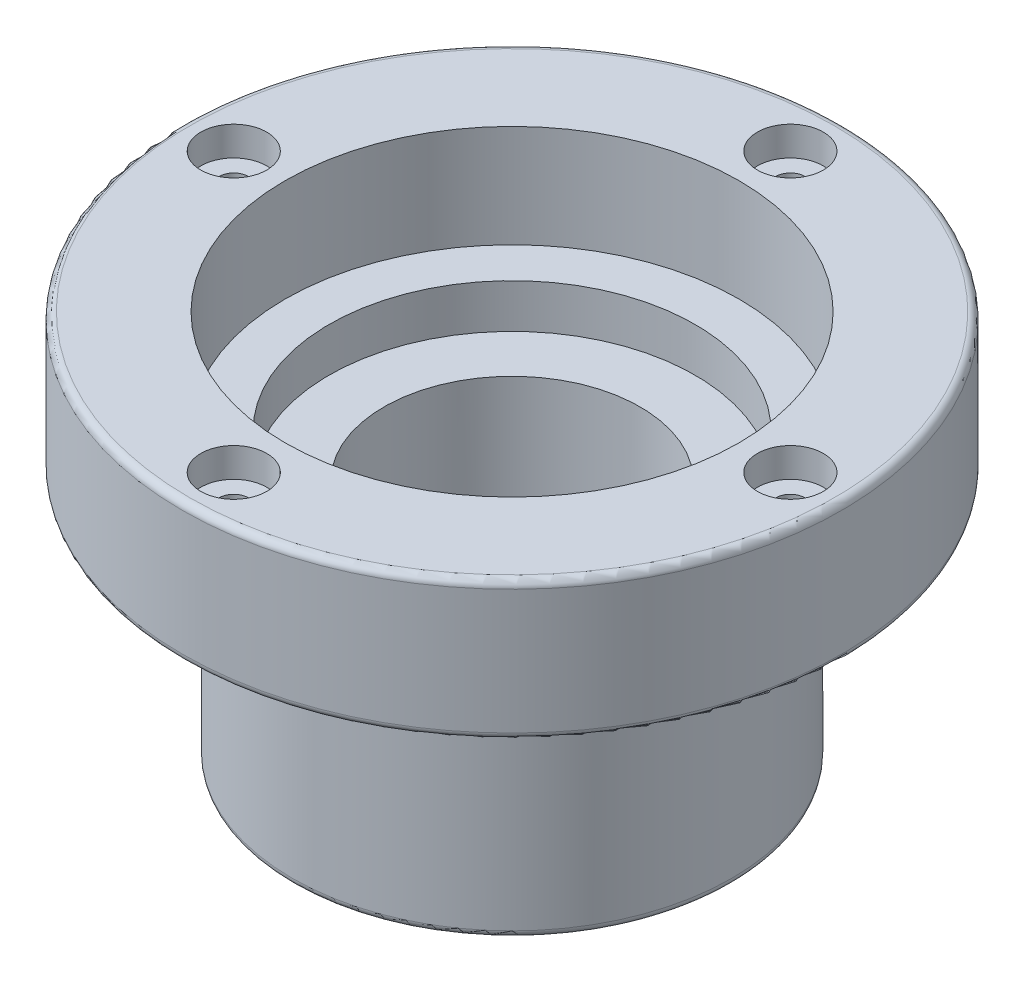
ISO-10303-21;
HEADER;
FILE_DESCRIPTION(('STEP AP214'),'2;1');
FILE_NAME('part.step','',(''),(''),'','','');
FILE_SCHEMA(('AUTOMOTIVE_DESIGN { 1 0 10303 214 1 1 1 1 }'));
ENDSEC;
DATA;
#1=APPLICATION_CONTEXT('core data for automotive mechanical design processes');
#2=APPLICATION_PROTOCOL_DEFINITION('international standard','automotive_design',2000,#1);
#3=PRODUCT_CONTEXT('',#1,'mechanical');
#4=PRODUCT('Part','Part','',(#3));
#5=PRODUCT_RELATED_PRODUCT_CATEGORY('part','',(#4));
#6=PRODUCT_DEFINITION_FORMATION('','',#4);
#7=PRODUCT_DEFINITION_CONTEXT('part definition',#1,'design');
#8=PRODUCT_DEFINITION('design','',#6,#7);
#9=PRODUCT_DEFINITION_SHAPE('','',#8);
#10=(LENGTH_UNIT() NAMED_UNIT(*) SI_UNIT(.MILLI.,.METRE.));
#11=(NAMED_UNIT(*) PLANE_ANGLE_UNIT() SI_UNIT($,.RADIAN.));
#12=(NAMED_UNIT(*) SI_UNIT($,.STERADIAN.) SOLID_ANGLE_UNIT());
#13=UNCERTAINTY_MEASURE_WITH_UNIT(LENGTH_MEASURE(1.E-05),#10,'distance_accuracy_value','');
#14=(GEOMETRIC_REPRESENTATION_CONTEXT(3) GLOBAL_UNCERTAINTY_ASSIGNED_CONTEXT((#13)) GLOBAL_UNIT_ASSIGNED_CONTEXT((#10,
#11,#12)) REPRESENTATION_CONTEXT('',''));
#15=CARTESIAN_POINT('',(0.,0.,0.));
#16=DIRECTION('',(0.,0.,1.));
#17=DIRECTION('',(1.,0.,0.));
#18=AXIS2_PLACEMENT_3D('',#15,#16,#17);
#19=CARTESIAN_POINT('',(0.,-20.,-38.));
#20=DIRECTION('',(0.,1.,0.));
#21=DIRECTION('',(0.,0.,1.));
#22=AXIS2_PLACEMENT_3D('',#19,#20,#21);
#23=CYLINDRICAL_SURFACE('',#22,2.);
#24=CARTESIAN_POINT('',(0.,-19.,-38.));
#25=DIRECTION('',(0.,1.,0.));
#26=DIRECTION('',(0.,0.,1.));
#27=AXIS2_PLACEMENT_3D('',#24,#25,#26);
#28=CIRCLE('',#27,2.);
#29=CARTESIAN_POINT('',(0.,-19.,-36.));
#30=VERTEX_POINT('',#29);
#31=EDGE_CURVE('E108',#30,#30,#28,.T.);
#32=ORIENTED_EDGE('',*,*,#31,.F.);
#33=EDGE_LOOP('',(#32));
#34=FACE_BOUND('',#33,.T.);
#35=CARTESIAN_POINT('',(0.,-4.,-38.));
#36=DIRECTION('',(0.,1.,0.));
#37=DIRECTION('',(0.,0.,1.));
#38=AXIS2_PLACEMENT_3D('',#35,#36,#37);
#39=CIRCLE('',#38,2.);
#40=CARTESIAN_POINT('',(0.,-4.,-36.));
#41=VERTEX_POINT('',#40);
#42=EDGE_CURVE('E39',#41,#41,#39,.F.);
#43=ORIENTED_EDGE('',*,*,#42,.F.);
#44=EDGE_LOOP('',(#43));
#45=FACE_BOUND('',#44,.T.);
#46=ADVANCED_FACE('F35',(#34,#45),#23,.F.);
#47=CARTESIAN_POINT('',(0.,-20.,38.));
#48=DIRECTION('',(0.,1.,0.));
#49=DIRECTION('',(0.,0.,1.));
#50=AXIS2_PLACEMENT_3D('',#47,#48,#49);
#51=CYLINDRICAL_SURFACE('',#50,2.);
#52=CARTESIAN_POINT('',(0.,-19.,38.));
#53=DIRECTION('',(0.,1.,0.));
#54=DIRECTION('',(0.,0.,1.));
#55=AXIS2_PLACEMENT_3D('',#52,#53,#54);
#56=CIRCLE('',#55,2.);
#57=CARTESIAN_POINT('',(0.,-19.,40.));
#58=VERTEX_POINT('',#57);
#59=EDGE_CURVE('E102',#58,#58,#56,.T.);
#60=ORIENTED_EDGE('',*,*,#59,.F.);
#61=EDGE_LOOP('',(#60));
#62=FACE_BOUND('',#61,.T.);
#63=CARTESIAN_POINT('',(0.,-4.,38.));
#64=DIRECTION('',(0.,1.,0.));
#65=DIRECTION('',(0.,0.,1.));
#66=AXIS2_PLACEMENT_3D('',#63,#64,#65);
#67=CIRCLE('',#66,2.);
#68=CARTESIAN_POINT('',(0.,-4.,40.));
#69=VERTEX_POINT('',#68);
#70=EDGE_CURVE('E59',#69,#69,#67,.F.);
#71=ORIENTED_EDGE('',*,*,#70,.F.);
#72=EDGE_LOOP('',(#71));
#73=FACE_BOUND('',#72,.T.);
#74=ADVANCED_FACE('F168',(#62,#73),#51,.F.);
#75=CARTESIAN_POINT('',(38.,-20.,1.32676290876039E-13));
#76=DIRECTION('',(0.,1.,0.));
#77=DIRECTION('',(0.,0.,1.));
#78=AXIS2_PLACEMENT_3D('',#75,#76,#77);
#79=CYLINDRICAL_SURFACE('',#78,2.);
#80=CARTESIAN_POINT('',(38.,-19.,1.32676290876039E-13));
#81=DIRECTION('',(0.,1.,0.));
#82=DIRECTION('',(0.,0.,1.));
#83=AXIS2_PLACEMENT_3D('',#80,#81,#82);
#84=CIRCLE('',#83,2.);
#85=CARTESIAN_POINT('',(38.,-19.,2.00000000000014));
#86=VERTEX_POINT('',#85);
#87=EDGE_CURVE('E105',#86,#86,#84,.T.);
#88=ORIENTED_EDGE('',*,*,#87,.F.);
#89=EDGE_LOOP('',(#88));
#90=FACE_BOUND('',#89,.T.);
#91=CARTESIAN_POINT('',(38.,-4.,1.32676290876039E-13));
#92=DIRECTION('',(0.,1.,0.));
#93=DIRECTION('',(0.,0.,1.));
#94=AXIS2_PLACEMENT_3D('',#91,#92,#93);
#95=CIRCLE('',#94,2.);
#96=CARTESIAN_POINT('',(38.,-4.,2.00000000000014));
#97=VERTEX_POINT('',#96);
#98=EDGE_CURVE('E57',#97,#97,#95,.F.);
#99=ORIENTED_EDGE('',*,*,#98,.F.);
#100=EDGE_LOOP('',(#99));
#101=FACE_BOUND('',#100,.T.);
#102=ADVANCED_FACE('F174',(#90,#101),#79,.F.);
#103=CARTESIAN_POINT('',(-38.,-20.,-3.98028872628117E-13));
#104=DIRECTION('',(0.,1.,0.));
#105=DIRECTION('',(0.,0.,1.));
#106=AXIS2_PLACEMENT_3D('',#103,#104,#105);
#107=CYLINDRICAL_SURFACE('',#106,2.);
#108=CARTESIAN_POINT('',(-38.,-19.,-3.98028872628117E-13));
#109=DIRECTION('',(0.,1.,0.));
#110=DIRECTION('',(0.,0.,1.));
#111=AXIS2_PLACEMENT_3D('',#108,#109,#110);
#112=CIRCLE('',#111,2.);
#113=CARTESIAN_POINT('',(-38.,-19.,1.9999999999996));
#114=VERTEX_POINT('',#113);
#115=EDGE_CURVE('E97',#114,#114,#112,.T.);
#116=ORIENTED_EDGE('',*,*,#115,.F.);
#117=EDGE_LOOP('',(#116));
#118=FACE_BOUND('',#117,.T.);
#119=CARTESIAN_POINT('',(-38.,-4.,-3.98028872628117E-13));
#120=DIRECTION('',(0.,1.,0.));
#121=DIRECTION('',(0.,0.,1.));
#122=AXIS2_PLACEMENT_3D('',#119,#120,#121);
#123=CIRCLE('',#122,2.);
#124=CARTESIAN_POINT('',(-38.,-4.,1.9999999999996));
#125=VERTEX_POINT('',#124);
#126=EDGE_CURVE('E52',#125,#125,#123,.F.);
#127=ORIENTED_EDGE('',*,*,#126,.F.);
#128=EDGE_LOOP('',(#127));
#129=FACE_BOUND('',#128,.T.);
#130=ADVANCED_FACE('F181',(#118,#129),#107,.F.);
#131=CARTESIAN_POINT('',(0.,-19.,0.));
#132=DIRECTION('',(0.,1.,0.));
#133=DIRECTION('',(0.,0.,1.));
#134=AXIS2_PLACEMENT_3D('',#131,#132,#133);
#135=CYLINDRICAL_SURFACE('',#134,45.);
#136=CARTESIAN_POINT('',(0.,-18.,0.));
#137=DIRECTION('',(0.,1.,0.));
#138=DIRECTION('',(0.,0.,1.));
#139=AXIS2_PLACEMENT_3D('',#136,#137,#138);
#140=CIRCLE('',#139,45.);
#141=CARTESIAN_POINT('',(0.,-18.,45.));
#142=VERTEX_POINT('',#141);
#143=EDGE_CURVE('E43',#142,#142,#140,.T.);
#144=ORIENTED_EDGE('',*,*,#143,.T.);
#145=EDGE_LOOP('',(#144));
#146=FACE_BOUND('',#145,.T.);
#147=CARTESIAN_POINT('',(0.,-1.,0.));
#148=DIRECTION('',(0.,1.,0.));
#149=DIRECTION('',(0.,0.,1.));
#150=AXIS2_PLACEMENT_3D('',#147,#148,#149);
#151=CIRCLE('',#150,45.);
#152=CARTESIAN_POINT('',(0.,-1.,45.));
#153=VERTEX_POINT('',#152);
#154=EDGE_CURVE('E48',#153,#153,#151,.F.);
#155=ORIENTED_EDGE('',*,*,#154,.T.);
#156=EDGE_LOOP('',(#155));
#157=FACE_BOUND('',#156,.T.);
#158=ADVANCED_FACE('F152',(#146,#157),#135,.T.);
#159=CARTESIAN_POINT('',(0.,-19.,0.));
#160=DIRECTION('',(0.,1.,0.));
#161=DIRECTION('',(0.,0.,1.));
#162=AXIS2_PLACEMENT_3D('',#159,#160,#161);
#163=PLANE('',#162);
#164=CARTESIAN_POINT('',(0.,-19.,0.));
#165=DIRECTION('',(0.,1.,0.));
#166=DIRECTION('',(0.,0.,1.));
#167=AXIS2_PLACEMENT_3D('',#164,#165,#166);
#168=CIRCLE('',#167,31.);
#169=CARTESIAN_POINT('',(0.,-19.,31.));
#170=VERTEX_POINT('',#169);
#171=EDGE_CURVE('E147',#170,#170,#168,.T.);
#172=ORIENTED_EDGE('',*,*,#171,.T.);
#173=EDGE_LOOP('',(#172));
#174=FACE_BOUND('',#173,.T.);
#175=CARTESIAN_POINT('',(0.,-19.,0.));
#176=DIRECTION('',(0.,1.,0.));
#177=DIRECTION('',(0.,0.,1.));
#178=AXIS2_PLACEMENT_3D('',#175,#176,#177);
#179=CIRCLE('',#178,44.);
#180=CARTESIAN_POINT('',(0.,-19.,44.));
#181=VERTEX_POINT('',#180);
#182=EDGE_CURVE('E144',#181,#181,#179,.F.);
#183=ORIENTED_EDGE('',*,*,#182,.T.);
#184=EDGE_LOOP('',(#183));
#185=FACE_BOUND('',#184,.T.);
#186=ORIENTED_EDGE('',*,*,#87,.T.);
#187=EDGE_LOOP('',(#186));
#188=FACE_BOUND('',#187,.T.);
#189=ORIENTED_EDGE('',*,*,#59,.T.);
#190=EDGE_LOOP('',(#189));
#191=FACE_BOUND('',#190,.T.);
#192=ORIENTED_EDGE('',*,*,#115,.T.);
#193=EDGE_LOOP('',(#192));
#194=FACE_BOUND('',#193,.T.);
#195=ORIENTED_EDGE('',*,*,#31,.T.);
#196=EDGE_LOOP('',(#195));
#197=FACE_BOUND('',#196,.T.);
#198=ADVANCED_FACE('F220',(#174,#185,#188,#191,#194,#197),#163,.F.);
#199=CARTESIAN_POINT('',(0.,0.,0.));
#200=DIRECTION('',(0.,1.,0.));
#201=DIRECTION('',(0.,0.,1.));
#202=AXIS2_PLACEMENT_3D('',#199,#200,#201);
#203=PLANE('',#202);
#204=CARTESIAN_POINT('',(-2.65352581752078E-13,0.,38.));
#205=DIRECTION('',(0.,1.,0.));
#206=DIRECTION('',(1.,0.,0.));
#207=AXIS2_PLACEMENT_3D('',#204,#205,#206);
#208=CIRCLE('',#207,4.5);
#209=CARTESIAN_POINT('',(4.49999999999974,0.,38.));
#210=VERTEX_POINT('',#209);
#211=EDGE_CURVE('E329',#210,#210,#208,.T.);
#212=ORIENTED_EDGE('',*,*,#211,.F.);
#213=EDGE_LOOP('',(#212));
#214=FACE_BOUND('',#213,.T.);
#215=CARTESIAN_POINT('',(38.,0.,3.98028872628117E-13));
#216=DIRECTION('',(0.,1.,0.));
#217=DIRECTION('',(0.,0.,-1.));
#218=AXIS2_PLACEMENT_3D('',#215,#216,#217);
#219=CIRCLE('',#218,4.5);
#220=CARTESIAN_POINT('',(38.,0.,-4.49999999999961));
#221=VERTEX_POINT('',#220);
#222=EDGE_CURVE('E334',#221,#221,#219,.T.);
#223=ORIENTED_EDGE('',*,*,#222,.F.);
#224=EDGE_LOOP('',(#223));
#225=FACE_BOUND('',#224,.T.);
#226=CARTESIAN_POINT('',(0.,0.,-38.));
#227=DIRECTION('',(0.,1.,0.));
#228=DIRECTION('',(-1.,0.,0.));
#229=AXIS2_PLACEMENT_3D('',#226,#227,#228);
#230=CIRCLE('',#229,4.5);
#231=CARTESIAN_POINT('',(-4.5,0.,-38.));
#232=VERTEX_POINT('',#231);
#233=EDGE_CURVE('E340',#232,#232,#230,.T.);
#234=ORIENTED_EDGE('',*,*,#233,.F.);
#235=EDGE_LOOP('',(#234));
#236=FACE_BOUND('',#235,.T.);
#237=CARTESIAN_POINT('',(-38.,0.,-3.98028872628117E-13));
#238=DIRECTION('',(0.,1.,0.));
#239=DIRECTION('',(0.,0.,1.));
#240=AXIS2_PLACEMENT_3D('',#237,#238,#239);
#241=CIRCLE('',#240,4.5);
#242=CARTESIAN_POINT('',(-38.,0.,4.49999999999961));
#243=VERTEX_POINT('',#242);
#244=EDGE_CURVE('E65',#243,#243,#241,.T.);
#245=ORIENTED_EDGE('',*,*,#244,.F.);
#246=EDGE_LOOP('',(#245));
#247=FACE_BOUND('',#246,.T.);
#248=CARTESIAN_POINT('',(0.,0.,0.));
#249=DIRECTION('',(0.,1.,0.));
#250=DIRECTION('',(0.,0.,1.));
#251=AXIS2_PLACEMENT_3D('',#248,#249,#250);
#252=CIRCLE('',#251,44.);
#253=CARTESIAN_POINT('',(0.,0.,44.));
#254=VERTEX_POINT('',#253);
#255=EDGE_CURVE('E10',#254,#254,#252,.T.);
#256=ORIENTED_EDGE('',*,*,#255,.T.);
#257=EDGE_LOOP('',(#256));
#258=FACE_BOUND('',#257,.T.);
#259=CARTESIAN_POINT('',(0.,0.,0.));
#260=DIRECTION('',(0.,1.,0.));
#261=DIRECTION('',(0.,0.,1.));
#262=AXIS2_PLACEMENT_3D('',#259,#260,#261);
#263=CIRCLE('',#262,31.);
#264=CARTESIAN_POINT('',(0.,0.,31.));
#265=VERTEX_POINT('',#264);
#266=EDGE_CURVE('E118',#265,#265,#263,.T.);
#267=ORIENTED_EDGE('',*,*,#266,.F.);
#268=EDGE_LOOP('',(#267));
#269=FACE_BOUND('',#268,.T.);
#270=ADVANCED_FACE('F218',(#214,#225,#236,#247,#258,#269),#203,.T.);
#271=CARTESIAN_POINT('',(0.,-53.,0.));
#272=DIRECTION('',(0.,1.,0.));
#273=DIRECTION('',(0.,0.,1.));
#274=AXIS2_PLACEMENT_3D('',#271,#272,#273);
#275=CYLINDRICAL_SURFACE('',#274,30.);
#276=CARTESIAN_POINT('',(0.,-52.,0.));
#277=DIRECTION('',(0.,-1.,0.));
#278=DIRECTION('',(0.,0.,-1.));
#279=AXIS2_PLACEMENT_3D('',#276,#277,#278);
#280=CIRCLE('',#279,30.);
#281=CARTESIAN_POINT('',(0.,-52.,-30.));
#282=VERTEX_POINT('',#281);
#283=EDGE_CURVE('E141',#282,#282,#280,.F.);
#284=ORIENTED_EDGE('',*,*,#283,.T.);
#285=EDGE_LOOP('',(#284));
#286=FACE_BOUND('',#285,.T.);
#287=CARTESIAN_POINT('',(0.,-20.,0.));
#288=DIRECTION('',(0.,1.,0.));
#289=DIRECTION('',(0.,0.,1.));
#290=AXIS2_PLACEMENT_3D('',#287,#288,#289);
#291=CIRCLE('',#290,30.);
#292=CARTESIAN_POINT('',(0.,-20.,30.));
#293=VERTEX_POINT('',#292);
#294=EDGE_CURVE('E138',#293,#293,#291,.F.);
#295=ORIENTED_EDGE('',*,*,#294,.T.);
#296=EDGE_LOOP('',(#295));
#297=FACE_BOUND('',#296,.T.);
#298=ADVANCED_FACE('F214',(#286,#297),#275,.T.);
#299=CARTESIAN_POINT('',(0.,-53.,0.));
#300=DIRECTION('',(0.,-1.,0.));
#301=DIRECTION('',(0.,0.,-1.));
#302=AXIS2_PLACEMENT_3D('',#299,#300,#301);
#303=PLANE('',#302);
#304=CARTESIAN_POINT('',(0.,-53.,0.));
#305=DIRECTION('',(0.,-1.,0.));
#306=DIRECTION('',(0.,0.,-1.));
#307=AXIS2_PLACEMENT_3D('',#304,#305,#306);
#308=CIRCLE('',#307,29.);
#309=CARTESIAN_POINT('',(0.,-53.,-29.));
#310=VERTEX_POINT('',#309);
#311=EDGE_CURVE('E131',#310,#310,#308,.T.);
#312=ORIENTED_EDGE('',*,*,#311,.T.);
#313=EDGE_LOOP('',(#312));
#314=FACE_BOUND('',#313,.T.);
#315=CARTESIAN_POINT('',(-27.,-53.,0.));
#316=DIRECTION('',(0.,-1.,0.));
#317=DIRECTION('',(1.,0.,0.));
#318=AXIS2_PLACEMENT_3D('',#315,#316,#317);
#319=CIRCLE('',#318,1.5);
#320=CARTESIAN_POINT('',(-25.5,-53.,0.));
#321=VERTEX_POINT('',#320);
#322=EDGE_CURVE('E80',#321,#321,#319,.T.);
#323=ORIENTED_EDGE('',*,*,#322,.F.);
#324=EDGE_LOOP('',(#323));
#325=FACE_BOUND('',#324,.T.);
#326=CARTESIAN_POINT('',(0.,-53.,-27.));
#327=DIRECTION('',(0.,-1.,0.));
#328=DIRECTION('',(0.,0.,1.));
#329=AXIS2_PLACEMENT_3D('',#326,#327,#328);
#330=CIRCLE('',#329,1.5);
#331=CARTESIAN_POINT('',(0.,-53.,-25.5));
#332=VERTEX_POINT('',#331);
#333=EDGE_CURVE('E86',#332,#332,#330,.T.);
#334=ORIENTED_EDGE('',*,*,#333,.F.);
#335=EDGE_LOOP('',(#334));
#336=FACE_BOUND('',#335,.T.);
#337=CARTESIAN_POINT('',(27.,-53.,2.82809988446294E-13));
#338=DIRECTION('',(0.,-1.,0.));
#339=DIRECTION('',(-1.,0.,0.));
#340=AXIS2_PLACEMENT_3D('',#337,#338,#339);
#341=CIRCLE('',#340,1.5);
#342=CARTESIAN_POINT('',(25.5,-53.,2.670983224215E-13));
#343=VERTEX_POINT('',#342);
#344=EDGE_CURVE('E55',#343,#343,#341,.T.);
#345=ORIENTED_EDGE('',*,*,#344,.F.);
#346=EDGE_LOOP('',(#345));
#347=FACE_BOUND('',#346,.T.);
#348=CARTESIAN_POINT('',(0.,-53.,27.));
#349=DIRECTION('',(0.,-1.,0.));
#350=DIRECTION('',(0.,0.,-1.));
#351=AXIS2_PLACEMENT_3D('',#348,#349,#350);
#352=CIRCLE('',#351,1.5);
#353=CARTESIAN_POINT('',(0.,-53.,25.5));
#354=VERTEX_POINT('',#353);
#355=EDGE_CURVE('E79',#354,#354,#352,.T.);
#356=ORIENTED_EDGE('',*,*,#355,.F.);
#357=EDGE_LOOP('',(#356));
#358=FACE_BOUND('',#357,.T.);
#359=CARTESIAN_POINT('',(0.,-53.,0.));
#360=DIRECTION('',(0.,-1.,0.));
#361=DIRECTION('',(0.,0.,-1.));
#362=AXIS2_PLACEMENT_3D('',#359,#360,#361);
#363=CIRCLE('',#362,23.5);
#364=CARTESIAN_POINT('',(0.,-53.,-23.5));
#365=VERTEX_POINT('',#364);
#366=EDGE_CURVE('E125',#365,#365,#363,.T.);
#367=ORIENTED_EDGE('',*,*,#366,.F.);
#368=EDGE_LOOP('',(#367));
#369=FACE_BOUND('',#368,.T.);
#370=ADVANCED_FACE('F210',(#314,#325,#336,#347,#358,#369),#303,.T.);
#371=CARTESIAN_POINT('',(0.,-39.,0.));
#372=DIRECTION('',(0.,-1.,0.));
#373=DIRECTION('',(0.,0.,-1.));
#374=AXIS2_PLACEMENT_3D('',#371,#372,#373);
#375=CYLINDRICAL_SURFACE('',#374,23.5);
#376=CARTESIAN_POINT('',(0.,-39.,0.));
#377=DIRECTION('',(0.,-1.,0.));
#378=DIRECTION('',(0.,0.,-1.));
#379=AXIS2_PLACEMENT_3D('',#376,#377,#378);
#380=CIRCLE('',#379,23.5);
#381=CARTESIAN_POINT('',(0.,-39.,-23.5));
#382=VERTEX_POINT('',#381);
#383=EDGE_CURVE('E128',#382,#382,#380,.T.);
#384=ORIENTED_EDGE('',*,*,#383,.F.);
#385=EDGE_LOOP('',(#384));
#386=FACE_BOUND('',#385,.T.);
#387=ORIENTED_EDGE('',*,*,#366,.T.);
#388=EDGE_LOOP('',(#387));
#389=FACE_BOUND('',#388,.T.);
#390=ADVANCED_FACE('F206',(#386,#389),#375,.F.);
#391=CARTESIAN_POINT('',(0.,-39.,0.));
#392=DIRECTION('',(0.,-1.,0.));
#393=DIRECTION('',(0.,0.,-1.));
#394=AXIS2_PLACEMENT_3D('',#391,#392,#393);
#395=PLANE('',#394);
#396=CARTESIAN_POINT('',(0.,-39.,0.));
#397=DIRECTION('',(0.,-1.,0.));
#398=DIRECTION('',(0.,0.,-1.));
#399=AXIS2_PLACEMENT_3D('',#396,#397,#398);
#400=CIRCLE('',#399,17.5);
#401=CARTESIAN_POINT('',(0.,-39.,-17.5));
#402=VERTEX_POINT('',#401);
#403=EDGE_CURVE('E114',#402,#402,#400,.T.);
#404=ORIENTED_EDGE('',*,*,#403,.F.);
#405=EDGE_LOOP('',(#404));
#406=FACE_BOUND('',#405,.T.);
#407=ORIENTED_EDGE('',*,*,#383,.T.);
#408=EDGE_LOOP('',(#407));
#409=FACE_BOUND('',#408,.T.);
#410=ADVANCED_FACE('F202',(#406,#409),#395,.T.);
#411=CARTESIAN_POINT('',(0.,-14.,0.));
#412=DIRECTION('',(0.,1.,0.));
#413=DIRECTION('',(0.,0.,1.));
#414=AXIS2_PLACEMENT_3D('',#411,#412,#413);
#415=CYLINDRICAL_SURFACE('',#414,31.);
#416=CARTESIAN_POINT('',(0.,-14.,0.));
#417=DIRECTION('',(0.,1.,0.));
#418=DIRECTION('',(0.,0.,1.));
#419=AXIS2_PLACEMENT_3D('',#416,#417,#418);
#420=CIRCLE('',#419,31.);
#421=CARTESIAN_POINT('',(0.,-14.,31.));
#422=VERTEX_POINT('',#421);
#423=EDGE_CURVE('E122',#422,#422,#420,.T.);
#424=ORIENTED_EDGE('',*,*,#423,.F.);
#425=EDGE_LOOP('',(#424));
#426=FACE_BOUND('',#425,.T.);
#427=ORIENTED_EDGE('',*,*,#266,.T.);
#428=EDGE_LOOP('',(#427));
#429=FACE_BOUND('',#428,.T.);
#430=ADVANCED_FACE('F198',(#426,#429),#415,.F.);
#431=CARTESIAN_POINT('',(0.,-14.,0.));
#432=DIRECTION('',(0.,1.,0.));
#433=DIRECTION('',(0.,0.,1.));
#434=AXIS2_PLACEMENT_3D('',#431,#432,#433);
#435=PLANE('',#434);
#436=CARTESIAN_POINT('',(0.,-14.,0.));
#437=DIRECTION('',(0.,1.,0.));
#438=DIRECTION('',(0.,0.,1.));
#439=AXIS2_PLACEMENT_3D('',#436,#437,#438);
#440=CIRCLE('',#439,25.);
#441=CARTESIAN_POINT('',(0.,-14.,25.));
#442=VERTEX_POINT('',#441);
#443=EDGE_CURVE('E119',#442,#442,#440,.T.);
#444=ORIENTED_EDGE('',*,*,#443,.F.);
#445=EDGE_LOOP('',(#444));
#446=FACE_BOUND('',#445,.T.);
#447=ORIENTED_EDGE('',*,*,#423,.T.);
#448=EDGE_LOOP('',(#447));
#449=FACE_BOUND('',#448,.T.);
#450=ADVANCED_FACE('F194',(#446,#449),#435,.T.);
#451=CARTESIAN_POINT('',(0.,-20.,0.));
#452=DIRECTION('',(0.,1.,0.));
#453=DIRECTION('',(0.,0.,1.));
#454=AXIS2_PLACEMENT_3D('',#451,#452,#453);
#455=CYLINDRICAL_SURFACE('',#454,25.);
#456=CARTESIAN_POINT('',(0.,-20.,0.));
#457=DIRECTION('',(0.,1.,0.));
#458=DIRECTION('',(0.,0.,1.));
#459=AXIS2_PLACEMENT_3D('',#456,#457,#458);
#460=CIRCLE('',#459,25.);
#461=CARTESIAN_POINT('',(0.,-20.,25.));
#462=VERTEX_POINT('',#461);
#463=EDGE_CURVE('E115',#462,#462,#460,.T.);
#464=ORIENTED_EDGE('',*,*,#463,.F.);
#465=EDGE_LOOP('',(#464));
#466=FACE_BOUND('',#465,.T.);
#467=ORIENTED_EDGE('',*,*,#443,.T.);
#468=EDGE_LOOP('',(#467));
#469=FACE_BOUND('',#468,.T.);
#470=ADVANCED_FACE('F190',(#466,#469),#455,.F.);
#471=CARTESIAN_POINT('',(0.,-20.,0.));
#472=DIRECTION('',(0.,1.,0.));
#473=DIRECTION('',(0.,0.,1.));
#474=AXIS2_PLACEMENT_3D('',#471,#472,#473);
#475=PLANE('',#474);
#476=CARTESIAN_POINT('',(0.,-20.,0.));
#477=DIRECTION('',(0.,1.,0.));
#478=DIRECTION('',(0.,0.,1.));
#479=AXIS2_PLACEMENT_3D('',#476,#477,#478);
#480=CIRCLE('',#479,17.5);
#481=CARTESIAN_POINT('',(0.,-20.,17.5));
#482=VERTEX_POINT('',#481);
#483=EDGE_CURVE('E111',#482,#482,#480,.T.);
#484=ORIENTED_EDGE('',*,*,#483,.F.);
#485=EDGE_LOOP('',(#484));
#486=FACE_BOUND('',#485,.T.);
#487=ORIENTED_EDGE('',*,*,#463,.T.);
#488=EDGE_LOOP('',(#487));
#489=FACE_BOUND('',#488,.T.);
#490=ADVANCED_FACE('F186',(#486,#489),#475,.T.);
#491=CARTESIAN_POINT('',(0.,-80.,0.));
#492=DIRECTION('',(0.,1.,0.));
#493=DIRECTION('',(0.,0.,1.));
#494=AXIS2_PLACEMENT_3D('',#491,#492,#493);
#495=CYLINDRICAL_SURFACE('',#494,17.5);
#496=ORIENTED_EDGE('',*,*,#403,.T.);
#497=EDGE_LOOP('',(#496));
#498=FACE_BOUND('',#497,.T.);
#499=ORIENTED_EDGE('',*,*,#483,.T.);
#500=EDGE_LOOP('',(#499));
#501=FACE_BOUND('',#500,.T.);
#502=ADVANCED_FACE('F182',(#498,#501),#495,.F.);
#503=CARTESIAN_POINT('',(0.,-41.,27.));
#504=DIRECTION('',(0.,-1.,0.));
#505=DIRECTION('',(0.,0.,-1.));
#506=AXIS2_PLACEMENT_3D('',#503,#504,#505);
#507=CYLINDRICAL_SURFACE('',#506,1.5);
#508=CARTESIAN_POINT('',(0.,-41.,27.));
#509=DIRECTION('',(0.,-1.,0.));
#510=DIRECTION('',(0.,0.,-1.));
#511=AXIS2_PLACEMENT_3D('',#508,#509,#510);
#512=CIRCLE('',#511,1.5);
#513=CARTESIAN_POINT('',(0.,-41.,25.5));
#514=VERTEX_POINT('',#513);
#515=EDGE_CURVE('E94',#514,#514,#512,.T.);
#516=ORIENTED_EDGE('',*,*,#515,.F.);
#517=EDGE_LOOP('',(#516));
#518=FACE_BOUND('',#517,.T.);
#519=ORIENTED_EDGE('',*,*,#355,.T.);
#520=EDGE_LOOP('',(#519));
#521=FACE_BOUND('',#520,.T.);
#522=ADVANCED_FACE('F185',(#518,#521),#507,.F.);
#523=CARTESIAN_POINT('',(0.,-41.,27.));
#524=DIRECTION('',(0.,-1.,0.));
#525=DIRECTION('',(0.,0.,-1.));
#526=AXIS2_PLACEMENT_3D('',#523,#524,#525);
#527=PLANE('',#526);
#528=ORIENTED_EDGE('',*,*,#515,.T.);
#529=EDGE_LOOP('',(#528));
#530=FACE_BOUND('',#529,.T.);
#531=ADVANCED_FACE('F268',(#530),#527,.T.);
#532=CARTESIAN_POINT('',(27.,-41.,2.82809988446294E-13));
#533=DIRECTION('',(0.,-1.,0.));
#534=DIRECTION('',(0.,0.,-1.));
#535=AXIS2_PLACEMENT_3D('',#532,#533,#534);
#536=CYLINDRICAL_SURFACE('',#535,1.5);
#537=CARTESIAN_POINT('',(27.,-41.,2.82809988446294E-13));
#538=DIRECTION('',(0.,-1.,0.));
#539=DIRECTION('',(-1.,0.,0.));
#540=AXIS2_PLACEMENT_3D('',#537,#538,#539);
#541=CIRCLE('',#540,1.5);
#542=CARTESIAN_POINT('',(25.5,-41.,2.670983224215E-13));
#543=VERTEX_POINT('',#542);
#544=EDGE_CURVE('E89',#543,#543,#541,.T.);
#545=ORIENTED_EDGE('',*,*,#544,.F.);
#546=EDGE_LOOP('',(#545));
#547=FACE_BOUND('',#546,.T.);
#548=ORIENTED_EDGE('',*,*,#344,.T.);
#549=EDGE_LOOP('',(#548));
#550=FACE_BOUND('',#549,.T.);
#551=ADVANCED_FACE('F272',(#547,#550),#536,.F.);
#552=CARTESIAN_POINT('',(27.,-41.,2.82809988446294E-13));
#553=DIRECTION('',(0.,-1.,0.));
#554=DIRECTION('',(-1.,0.,0.));
#555=AXIS2_PLACEMENT_3D('',#552,#553,#554);
#556=PLANE('',#555);
#557=ORIENTED_EDGE('',*,*,#544,.T.);
#558=EDGE_LOOP('',(#557));
#559=FACE_BOUND('',#558,.T.);
#560=ADVANCED_FACE('F276',(#559),#556,.T.);
#561=CARTESIAN_POINT('',(0.,-41.,-27.));
#562=DIRECTION('',(0.,-1.,0.));
#563=DIRECTION('',(0.,0.,-1.));
#564=AXIS2_PLACEMENT_3D('',#561,#562,#563);
#565=CYLINDRICAL_SURFACE('',#564,1.5);
#566=CARTESIAN_POINT('',(0.,-41.,-27.));
#567=DIRECTION('',(0.,-1.,0.));
#568=DIRECTION('',(0.,0.,1.));
#569=AXIS2_PLACEMENT_3D('',#566,#567,#568);
#570=CIRCLE('',#569,1.5);
#571=CARTESIAN_POINT('',(0.,-41.,-25.5));
#572=VERTEX_POINT('',#571);
#573=EDGE_CURVE('E83',#572,#572,#570,.T.);
#574=ORIENTED_EDGE('',*,*,#573,.F.);
#575=EDGE_LOOP('',(#574));
#576=FACE_BOUND('',#575,.T.);
#577=ORIENTED_EDGE('',*,*,#333,.T.);
#578=EDGE_LOOP('',(#577));
#579=FACE_BOUND('',#578,.T.);
#580=ADVANCED_FACE('F280',(#576,#579),#565,.F.);
#581=CARTESIAN_POINT('',(0.,-41.,-27.));
#582=DIRECTION('',(0.,-1.,0.));
#583=DIRECTION('',(0.,0.,1.));
#584=AXIS2_PLACEMENT_3D('',#581,#582,#583);
#585=PLANE('',#584);
#586=ORIENTED_EDGE('',*,*,#573,.T.);
#587=EDGE_LOOP('',(#586));
#588=FACE_BOUND('',#587,.T.);
#589=ADVANCED_FACE('F284',(#588),#585,.T.);
#590=CARTESIAN_POINT('',(-27.,-41.,0.));
#591=DIRECTION('',(0.,-1.,0.));
#592=DIRECTION('',(0.,0.,-1.));
#593=AXIS2_PLACEMENT_3D('',#590,#591,#592);
#594=CYLINDRICAL_SURFACE('',#593,1.5);
#595=CARTESIAN_POINT('',(-27.,-41.,0.));
#596=DIRECTION('',(0.,-1.,0.));
#597=DIRECTION('',(1.,0.,0.));
#598=AXIS2_PLACEMENT_3D('',#595,#596,#597);
#599=CIRCLE('',#598,1.5);
#600=CARTESIAN_POINT('',(-25.5,-41.,0.));
#601=VERTEX_POINT('',#600);
#602=EDGE_CURVE('E76',#601,#601,#599,.T.);
#603=ORIENTED_EDGE('',*,*,#602,.F.);
#604=EDGE_LOOP('',(#603));
#605=FACE_BOUND('',#604,.T.);
#606=ORIENTED_EDGE('',*,*,#322,.T.);
#607=EDGE_LOOP('',(#606));
#608=FACE_BOUND('',#607,.T.);
#609=ADVANCED_FACE('F288',(#605,#608),#594,.F.);
#610=CARTESIAN_POINT('',(-27.,-41.,0.));
#611=DIRECTION('',(0.,-1.,0.));
#612=DIRECTION('',(1.,0.,0.));
#613=AXIS2_PLACEMENT_3D('',#610,#611,#612);
#614=PLANE('',#613);
#615=ORIENTED_EDGE('',*,*,#602,.T.);
#616=EDGE_LOOP('',(#615));
#617=FACE_BOUND('',#616,.T.);
#618=ADVANCED_FACE('F233',(#617),#614,.T.);
#619=CARTESIAN_POINT('',(0.,-52.,0.));
#620=DIRECTION('',(0.,-1.,0.));
#621=DIRECTION('',(0.,0.,-1.));
#622=AXIS2_PLACEMENT_3D('',#619,#620,#621);
#623=TOROIDAL_SURFACE('',#622,29.,1.);
#624=ORIENTED_EDGE('',*,*,#283,.F.);
#625=EDGE_LOOP('',(#624));
#626=FACE_BOUND('',#625,.T.);
#627=ORIENTED_EDGE('',*,*,#311,.F.);
#628=EDGE_LOOP('',(#627));
#629=FACE_BOUND('',#628,.T.);
#630=ADVANCED_FACE('F230',(#626,#629),#623,.T.);
#631=CARTESIAN_POINT('',(0.,-20.,0.));
#632=DIRECTION('',(0.,1.,0.));
#633=DIRECTION('',(0.,0.,1.));
#634=AXIS2_PLACEMENT_3D('',#631,#632,#633);
#635=TOROIDAL_SURFACE('',#634,31.,1.);
#636=ORIENTED_EDGE('',*,*,#171,.F.);
#637=EDGE_LOOP('',(#636));
#638=FACE_BOUND('',#637,.T.);
#639=ORIENTED_EDGE('',*,*,#294,.F.);
#640=EDGE_LOOP('',(#639));
#641=FACE_BOUND('',#640,.T.);
#642=ADVANCED_FACE('F165',(#638,#641),#635,.F.);
#643=CARTESIAN_POINT('',(0.,-18.,0.));
#644=DIRECTION('',(0.,1.,0.));
#645=DIRECTION('',(0.,0.,1.));
#646=AXIS2_PLACEMENT_3D('',#643,#644,#645);
#647=TOROIDAL_SURFACE('',#646,44.,1.);
#648=ORIENTED_EDGE('',*,*,#182,.F.);
#649=EDGE_LOOP('',(#648));
#650=FACE_BOUND('',#649,.T.);
#651=ORIENTED_EDGE('',*,*,#143,.F.);
#652=EDGE_LOOP('',(#651));
#653=FACE_BOUND('',#652,.T.);
#654=ADVANCED_FACE('F157',(#650,#653),#647,.T.);
#655=CARTESIAN_POINT('',(0.,-1.,0.));
#656=DIRECTION('',(0.,1.,0.));
#657=DIRECTION('',(0.,0.,1.));
#658=AXIS2_PLACEMENT_3D('',#655,#656,#657);
#659=TOROIDAL_SURFACE('',#658,44.,1.);
#660=ORIENTED_EDGE('',*,*,#154,.F.);
#661=EDGE_LOOP('',(#660));
#662=FACE_BOUND('',#661,.T.);
#663=ORIENTED_EDGE('',*,*,#255,.F.);
#664=EDGE_LOOP('',(#663));
#665=FACE_BOUND('',#664,.T.);
#666=ADVANCED_FACE('F37',(#662,#665),#659,.T.);
#667=CARTESIAN_POINT('',(-38.,-4.,-3.98028872628117E-13));
#668=DIRECTION('',(0.,1.,0.));
#669=DIRECTION('',(0.,0.,1.));
#670=AXIS2_PLACEMENT_3D('',#667,#668,#669);
#671=PLANE('',#670);
#672=CARTESIAN_POINT('',(-38.,-4.,-3.98028872628117E-13));
#673=DIRECTION('',(0.,1.,0.));
#674=DIRECTION('',(0.,0.,1.));
#675=AXIS2_PLACEMENT_3D('',#672,#673,#674);
#676=CIRCLE('',#675,4.5);
#677=CARTESIAN_POINT('',(-38.,-4.,4.49999999999961));
#678=VERTEX_POINT('',#677);
#679=EDGE_CURVE('E56',#678,#678,#676,.T.);
#680=ORIENTED_EDGE('',*,*,#679,.T.);
#681=EDGE_LOOP('',(#680));
#682=FACE_BOUND('',#681,.T.);
#683=ORIENTED_EDGE('',*,*,#126,.T.);
#684=EDGE_LOOP('',(#683));
#685=FACE_BOUND('',#684,.T.);
#686=ADVANCED_FACE('F156',(#682,#685),#671,.T.);
#687=CARTESIAN_POINT('',(-38.,-4.,-3.98028872628117E-13));
#688=DIRECTION('',(0.,1.,0.));
#689=DIRECTION('',(0.,0.,1.));
#690=AXIS2_PLACEMENT_3D('',#687,#688,#689);
#691=CYLINDRICAL_SURFACE('',#690,4.5);
#692=ORIENTED_EDGE('',*,*,#679,.F.);
#693=EDGE_LOOP('',(#692));
#694=FACE_BOUND('',#693,.T.);
#695=ORIENTED_EDGE('',*,*,#244,.T.);
#696=EDGE_LOOP('',(#695));
#697=FACE_BOUND('',#696,.T.);
#698=ADVANCED_FACE('F162',(#694,#697),#691,.F.);
#699=CARTESIAN_POINT('',(38.,-4.,3.98028872628117E-13));
#700=DIRECTION('',(0.,1.,0.));
#701=DIRECTION('',(0.,0.,-1.));
#702=AXIS2_PLACEMENT_3D('',#699,#700,#701);
#703=PLANE('',#702);
#704=CARTESIAN_POINT('',(38.,-4.,3.98028872628117E-13));
#705=DIRECTION('',(0.,1.,0.));
#706=DIRECTION('',(0.,0.,-1.));
#707=AXIS2_PLACEMENT_3D('',#704,#705,#706);
#708=CIRCLE('',#707,4.5);
#709=CARTESIAN_POINT('',(38.,-4.,-4.49999999999961));
#710=VERTEX_POINT('',#709);
#711=EDGE_CURVE('E330',#710,#710,#708,.T.);
#712=ORIENTED_EDGE('',*,*,#711,.T.);
#713=EDGE_LOOP('',(#712));
#714=FACE_BOUND('',#713,.T.);
#715=ORIENTED_EDGE('',*,*,#98,.T.);
#716=EDGE_LOOP('',(#715));
#717=FACE_BOUND('',#716,.T.);
#718=ADVANCED_FACE('F297',(#714,#717),#703,.T.);
#719=CARTESIAN_POINT('',(38.,-4.,3.98028872628117E-13));
#720=DIRECTION('',(0.,1.,0.));
#721=DIRECTION('',(0.,0.,-1.));
#722=AXIS2_PLACEMENT_3D('',#719,#720,#721);
#723=CYLINDRICAL_SURFACE('',#722,4.5);
#724=ORIENTED_EDGE('',*,*,#711,.F.);
#725=EDGE_LOOP('',(#724));
#726=FACE_BOUND('',#725,.T.);
#727=ORIENTED_EDGE('',*,*,#222,.T.);
#728=EDGE_LOOP('',(#727));
#729=FACE_BOUND('',#728,.T.);
#730=ADVANCED_FACE('F311',(#726,#729),#723,.F.);
#731=CARTESIAN_POINT('',(-2.65352581752078E-13,-4.,38.));
#732=DIRECTION('',(0.,1.,0.));
#733=DIRECTION('',(1.,0.,0.));
#734=AXIS2_PLACEMENT_3D('',#731,#732,#733);
#735=PLANE('',#734);
#736=CARTESIAN_POINT('',(-2.65352581752078E-13,-4.,38.));
#737=DIRECTION('',(0.,1.,0.));
#738=DIRECTION('',(1.,0.,0.));
#739=AXIS2_PLACEMENT_3D('',#736,#737,#738);
#740=CIRCLE('',#739,4.5);
#741=CARTESIAN_POINT('',(4.49999999999974,-4.,38.));
#742=VERTEX_POINT('',#741);
#743=EDGE_CURVE('E60',#742,#742,#740,.T.);
#744=ORIENTED_EDGE('',*,*,#743,.T.);
#745=EDGE_LOOP('',(#744));
#746=FACE_BOUND('',#745,.T.);
#747=ORIENTED_EDGE('',*,*,#70,.T.);
#748=EDGE_LOOP('',(#747));
#749=FACE_BOUND('',#748,.T.);
#750=ADVANCED_FACE('F315',(#746,#749),#735,.T.);
#751=CARTESIAN_POINT('',(-2.65352581752078E-13,-4.,38.));
#752=DIRECTION('',(0.,1.,0.));
#753=DIRECTION('',(1.,0.,0.));
#754=AXIS2_PLACEMENT_3D('',#751,#752,#753);
#755=CYLINDRICAL_SURFACE('',#754,4.5);
#756=ORIENTED_EDGE('',*,*,#743,.F.);
#757=EDGE_LOOP('',(#756));
#758=FACE_BOUND('',#757,.T.);
#759=ORIENTED_EDGE('',*,*,#211,.T.);
#760=EDGE_LOOP('',(#759));
#761=FACE_BOUND('',#760,.T.);
#762=ADVANCED_FACE('F304',(#758,#761),#755,.F.);
#763=CARTESIAN_POINT('',(0.,-4.,-38.));
#764=DIRECTION('',(0.,1.,0.));
#765=DIRECTION('',(-1.,0.,0.));
#766=AXIS2_PLACEMENT_3D('',#763,#764,#765);
#767=PLANE('',#766);
#768=CARTESIAN_POINT('',(0.,-4.,-38.));
#769=DIRECTION('',(0.,1.,0.));
#770=DIRECTION('',(-1.,0.,0.));
#771=AXIS2_PLACEMENT_3D('',#768,#769,#770);
#772=CIRCLE('',#771,4.5);
#773=CARTESIAN_POINT('',(-4.5,-4.,-38.));
#774=VERTEX_POINT('',#773);
#775=EDGE_CURVE('E338',#774,#774,#772,.T.);
#776=ORIENTED_EDGE('',*,*,#775,.T.);
#777=EDGE_LOOP('',(#776));
#778=FACE_BOUND('',#777,.T.);
#779=ORIENTED_EDGE('',*,*,#42,.T.);
#780=EDGE_LOOP('',(#779));
#781=FACE_BOUND('',#780,.T.);
#782=ADVANCED_FACE('F300',(#778,#781),#767,.T.);
#783=CARTESIAN_POINT('',(0.,-4.,-38.));
#784=DIRECTION('',(0.,1.,0.));
#785=DIRECTION('',(-1.,0.,0.));
#786=AXIS2_PLACEMENT_3D('',#783,#784,#785);
#787=CYLINDRICAL_SURFACE('',#786,4.5);
#788=ORIENTED_EDGE('',*,*,#775,.F.);
#789=EDGE_LOOP('',(#788));
#790=FACE_BOUND('',#789,.T.);
#791=ORIENTED_EDGE('',*,*,#233,.T.);
#792=EDGE_LOOP('',(#791));
#793=FACE_BOUND('',#792,.T.);
#794=ADVANCED_FACE('F303',(#790,#793),#787,.F.);
#795=CLOSED_SHELL('',(#46,#74,#102,#130,#158,#198,#270,#298,#370,#390,#410,#430,#450,#470,#490,
#502,#522,#531,#551,#560,#580,#589,#609,#618,#630,#642,#654,#666,#686,#698,#718,#730,#750,#762,
#782,#794));
#796=MANIFOLD_SOLID_BREP('B2',#795);
#797=ADVANCED_BREP_SHAPE_REPRESENTATION('',(#18,#796),#14);
#798=SHAPE_DEFINITION_REPRESENTATION(#9,#797);
ENDSEC;
END-ISO-10303-21;
